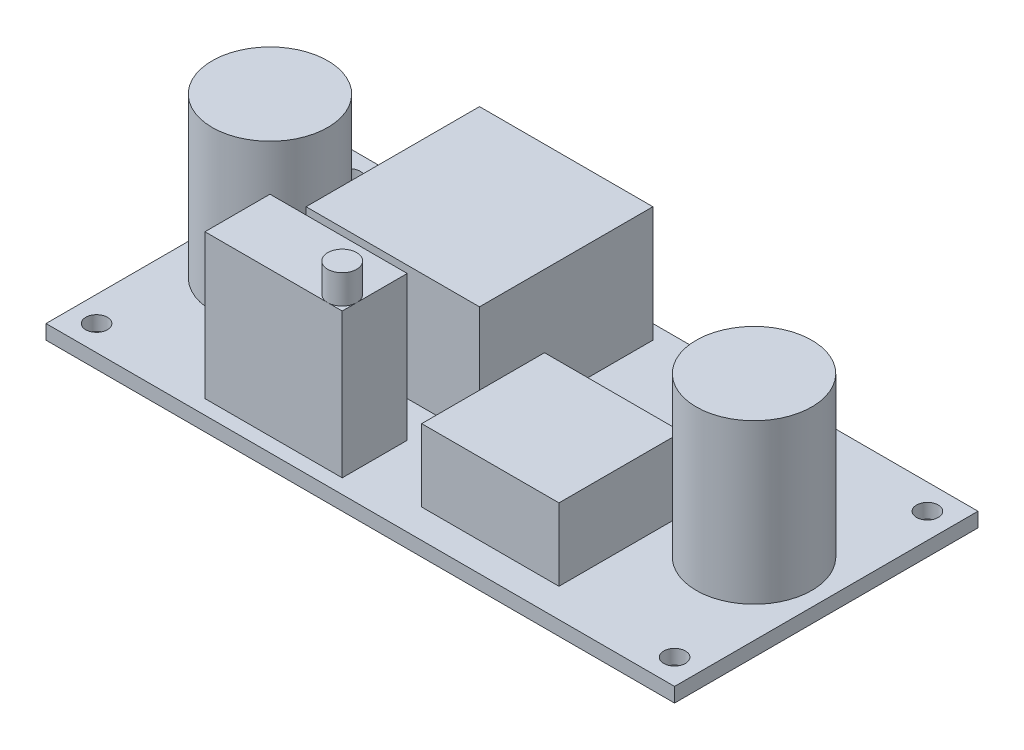
ISO-10303-21;
HEADER;
FILE_DESCRIPTION(('STEP AP214'),'2;1');
FILE_NAME('part.step','',(''),(''),'','','');
FILE_SCHEMA(('AUTOMOTIVE_DESIGN { 1 0 10303 214 1 1 1 1 }'));
ENDSEC;
DATA;
#1=APPLICATION_CONTEXT('core data for automotive mechanical design processes');
#2=APPLICATION_PROTOCOL_DEFINITION('international standard','automotive_design',2000,#1);
#3=PRODUCT_CONTEXT('',#1,'mechanical');
#4=PRODUCT('Part','Part','',(#3));
#5=PRODUCT_RELATED_PRODUCT_CATEGORY('part','',(#4));
#6=PRODUCT_DEFINITION_FORMATION('','',#4);
#7=PRODUCT_DEFINITION_CONTEXT('part definition',#1,'design');
#8=PRODUCT_DEFINITION('design','',#6,#7);
#9=PRODUCT_DEFINITION_SHAPE('','',#8);
#10=(LENGTH_UNIT() NAMED_UNIT(*) SI_UNIT(.MILLI.,.METRE.));
#11=(NAMED_UNIT(*) PLANE_ANGLE_UNIT() SI_UNIT($,.RADIAN.));
#12=(NAMED_UNIT(*) SI_UNIT($,.STERADIAN.) SOLID_ANGLE_UNIT());
#13=UNCERTAINTY_MEASURE_WITH_UNIT(LENGTH_MEASURE(1.E-05),#10,'distance_accuracy_value','');
#14=(GEOMETRIC_REPRESENTATION_CONTEXT(3) GLOBAL_UNCERTAINTY_ASSIGNED_CONTEXT((#13)) GLOBAL_UNIT_ASSIGNED_CONTEXT((#10,
#11,#12)) REPRESENTATION_CONTEXT('',''));
#15=CARTESIAN_POINT('',(0.,0.,0.));
#16=DIRECTION('',(0.,0.,1.));
#17=DIRECTION('',(1.,0.,0.));
#18=AXIS2_PLACEMENT_3D('',#15,#16,#17);
#19=CARTESIAN_POINT('',(0.,10.,0.));
#20=DIRECTION('',(0.,1.,0.));
#21=DIRECTION('',(0.,0.,1.));
#22=AXIS2_PLACEMENT_3D('',#19,#20,#21);
#23=PLANE('',#22);
#24=CARTESIAN_POINT('',(-3.25,10.,8.5));
#25=DIRECTION('',(0.,1.,0.));
#26=DIRECTION('',(0.,0.,1.));
#27=AXIS2_PLACEMENT_3D('',#24,#25,#26);
#28=CIRCLE('',#27,1.);
#29=CARTESIAN_POINT('',(-3.25,10.,9.5));
#30=VERTEX_POINT('',#29);
#31=CARTESIAN_POINT('',(-2.25,10.,8.5));
#32=VERTEX_POINT('',#31);
#33=EDGE_CURVE('E46',#30,#32,#28,.T.);
#34=ORIENTED_EDGE('',*,*,#33,.F.);
#35=DIRECTION('',(1.,0.,0.));
#36=VECTOR('',#35,1.);
#37=CARTESIAN_POINT('',(0.,10.,9.5));
#38=LINE('',#37,#36);
#39=CARTESIAN_POINT('',(-2.25,10.,9.5));
#40=VERTEX_POINT('',#39);
#41=EDGE_CURVE('E163',#30,#40,#38,.T.);
#42=ORIENTED_EDGE('',*,*,#41,.T.);
#43=DIRECTION('',(0.,0.,1.));
#44=VECTOR('',#43,1.);
#45=CARTESIAN_POINT('',(-2.25,10.,0.));
#46=LINE('',#45,#44);
#47=EDGE_CURVE('E172',#32,#40,#46,.T.);
#48=ORIENTED_EDGE('',*,*,#47,.F.);
#49=EDGE_LOOP('',(#34,#42,#48));
#50=FACE_BOUND('',#49,.T.);
#51=ADVANCED_FACE('F35',(#50),#23,.T.);
#52=CARTESIAN_POINT('',(0.,0.,0.));
#53=DIRECTION('',(0.,1.,0.));
#54=DIRECTION('',(0.,0.,1.));
#55=AXIS2_PLACEMENT_3D('',#52,#53,#54);
#56=PLANE('',#55);
#57=DIRECTION('',(0.,0.,1.));
#58=VECTOR('',#57,1.);
#59=CARTESIAN_POINT('',(-2.25,0.,0.));
#60=LINE('',#59,#58);
#61=CARTESIAN_POINT('',(-2.25,0.,5.));
#62=VERTEX_POINT('',#61);
#63=CARTESIAN_POINT('',(-2.25,0.,9.5));
#64=VERTEX_POINT('',#63);
#65=EDGE_CURVE('E413',#62,#64,#60,.T.);
#66=ORIENTED_EDGE('',*,*,#65,.T.);
#67=DIRECTION('',(1.,0.,0.));
#68=VECTOR('',#67,1.);
#69=CARTESIAN_POINT('',(0.,0.,9.5));
#70=LINE('',#69,#68);
#71=CARTESIAN_POINT('',(-11.75,0.,9.5));
#72=VERTEX_POINT('',#71);
#73=EDGE_CURVE('E405',#72,#64,#70,.T.);
#74=ORIENTED_EDGE('',*,*,#73,.F.);
#75=DIRECTION('',(0.,0.,1.));
#76=VECTOR('',#75,1.);
#77=CARTESIAN_POINT('',(-11.75,0.,0.));
#78=LINE('',#77,#76);
#79=CARTESIAN_POINT('',(-11.75,0.,5.));
#80=VERTEX_POINT('',#79);
#81=EDGE_CURVE('E407',#80,#72,#78,.T.);
#82=ORIENTED_EDGE('',*,*,#81,.F.);
#83=DIRECTION('',(1.,0.,0.));
#84=VECTOR('',#83,1.);
#85=CARTESIAN_POINT('',(0.,0.,5.));
#86=LINE('',#85,#84);
#87=EDGE_CURVE('E410',#80,#62,#86,.T.);
#88=ORIENTED_EDGE('',*,*,#87,.T.);
#89=EDGE_LOOP('',(#66,#74,#82,#88));
#90=FACE_BOUND('',#89,.T.);
#91=DIRECTION('',(0.,0.,1.));
#92=VECTOR('',#91,1.);
#93=CARTESIAN_POINT('',(11.75,0.,0.));
#94=LINE('',#93,#92);
#95=CARTESIAN_POINT('',(11.75,0.,0.));
#96=VERTEX_POINT('',#95);
#97=CARTESIAN_POINT('',(11.75,0.,8.5));
#98=VERTEX_POINT('',#97);
#99=EDGE_CURVE('E387',#96,#98,#94,.T.);
#100=ORIENTED_EDGE('',*,*,#99,.T.);
#101=DIRECTION('',(1.,0.,0.));
#102=VECTOR('',#101,1.);
#103=CARTESIAN_POINT('',(0.,0.,8.5));
#104=LINE('',#103,#102);
#105=CARTESIAN_POINT('',(2.25,0.,8.5));
#106=VERTEX_POINT('',#105);
#107=EDGE_CURVE('E377',#106,#98,#104,.T.);
#108=ORIENTED_EDGE('',*,*,#107,.F.);
#109=DIRECTION('',(0.,0.,1.));
#110=VECTOR('',#109,1.);
#111=CARTESIAN_POINT('',(2.25,0.,0.));
#112=LINE('',#111,#110);
#113=CARTESIAN_POINT('',(2.25,0.,0.));
#114=VERTEX_POINT('',#113);
#115=EDGE_CURVE('E381',#114,#106,#112,.T.);
#116=ORIENTED_EDGE('',*,*,#115,.F.);
#117=DIRECTION('',(1.,0.,0.));
#118=VECTOR('',#117,1.);
#119=CARTESIAN_POINT('',(0.,0.,0.));
#120=LINE('',#119,#118);
#121=EDGE_CURVE('E384',#114,#96,#120,.T.);
#122=ORIENTED_EDGE('',*,*,#121,.T.);
#123=EDGE_LOOP('',(#100,#108,#116,#122));
#124=FACE_BOUND('',#123,.T.);
#125=CARTESIAN_POINT('',(16.75,0.,0.));
#126=DIRECTION('',(0.,1.,0.));
#127=DIRECTION('',(0.,0.,1.));
#128=AXIS2_PLACEMENT_3D('',#125,#126,#127);
#129=CIRCLE('',#128,4.);
#130=CARTESIAN_POINT('',(16.75,0.,3.99999999999999));
#131=VERTEX_POINT('',#130);
#132=EDGE_CURVE('E363',#131,#131,#129,.T.);
#133=ORIENTED_EDGE('',*,*,#132,.F.);
#134=EDGE_LOOP('',(#133));
#135=FACE_BOUND('',#134,.T.);
#136=CARTESIAN_POINT('',(-16.75,0.,0.));
#137=DIRECTION('',(0.,1.,0.));
#138=DIRECTION('',(0.,0.,1.));
#139=AXIS2_PLACEMENT_3D('',#136,#137,#138);
#140=CIRCLE('',#139,4.);
#141=CARTESIAN_POINT('',(-16.75,0.,4.));
#142=VERTEX_POINT('',#141);
#143=EDGE_CURVE('E357',#142,#142,#140,.T.);
#144=ORIENTED_EDGE('',*,*,#143,.F.);
#145=EDGE_LOOP('',(#144));
#146=FACE_BOUND('',#145,.T.);
#147=CARTESIAN_POINT('',(-20.,0.,8.75));
#148=DIRECTION('',(0.,1.,0.));
#149=DIRECTION('',(0.,0.,1.));
#150=AXIS2_PLACEMENT_3D('',#147,#148,#149);
#151=CIRCLE('',#150,0.750000000000002);
#152=CARTESIAN_POINT('',(-20.,0.,9.5));
#153=VERTEX_POINT('',#152);
#154=EDGE_CURVE('E304',#153,#153,#151,.T.);
#155=ORIENTED_EDGE('',*,*,#154,.F.);
#156=EDGE_LOOP('',(#155));
#157=FACE_BOUND('',#156,.T.);
#158=CARTESIAN_POINT('',(20.,0.,8.74999999999999));
#159=DIRECTION('',(0.,1.,0.));
#160=DIRECTION('',(0.,0.,1.));
#161=AXIS2_PLACEMENT_3D('',#158,#159,#160);
#162=CIRCLE('',#161,0.750000000000002);
#163=CARTESIAN_POINT('',(20.,0.,9.5));
#164=VERTEX_POINT('',#163);
#165=EDGE_CURVE('E301',#164,#164,#162,.T.);
#166=ORIENTED_EDGE('',*,*,#165,.F.);
#167=EDGE_LOOP('',(#166));
#168=FACE_BOUND('',#167,.T.);
#169=CARTESIAN_POINT('',(20.,0.,-8.74999999999999));
#170=DIRECTION('',(0.,1.,0.));
#171=DIRECTION('',(0.,0.,1.));
#172=AXIS2_PLACEMENT_3D('',#169,#170,#171);
#173=CIRCLE('',#172,0.750000000000002);
#174=CARTESIAN_POINT('',(20.,0.,-7.99999999999999));
#175=VERTEX_POINT('',#174);
#176=EDGE_CURVE('E303',#175,#175,#173,.T.);
#177=ORIENTED_EDGE('',*,*,#176,.F.);
#178=EDGE_LOOP('',(#177));
#179=FACE_BOUND('',#178,.T.);
#180=CARTESIAN_POINT('',(-20.,0.,-8.75));
#181=DIRECTION('',(0.,1.,0.));
#182=DIRECTION('',(0.,0.,1.));
#183=AXIS2_PLACEMENT_3D('',#180,#181,#182);
#184=CIRCLE('',#183,0.750000000000002);
#185=CARTESIAN_POINT('',(-20.,0.,-8.));
#186=VERTEX_POINT('',#185);
#187=EDGE_CURVE('E307',#186,#186,#184,.T.);
#188=ORIENTED_EDGE('',*,*,#187,.F.);
#189=EDGE_LOOP('',(#188));
#190=FACE_BOUND('',#189,.T.);
#191=DIRECTION('',(0.,0.,1.));
#192=VECTOR('',#191,1.);
#193=CARTESIAN_POINT('',(21.75,0.,0.));
#194=LINE('',#193,#192);
#195=CARTESIAN_POINT('',(21.75,0.,-10.5));
#196=VERTEX_POINT('',#195);
#197=CARTESIAN_POINT('',(21.75,0.,10.5));
#198=VERTEX_POINT('',#197);
#199=EDGE_CURVE('E316',#196,#198,#194,.T.);
#200=ORIENTED_EDGE('',*,*,#199,.F.);
#201=DIRECTION('',(1.,0.,0.));
#202=VECTOR('',#201,1.);
#203=CARTESIAN_POINT('',(0.,0.,-10.5));
#204=LINE('',#203,#202);
#205=CARTESIAN_POINT('',(-21.75,0.,-10.5));
#206=VERTEX_POINT('',#205);
#207=EDGE_CURVE('E319',#206,#196,#204,.T.);
#208=ORIENTED_EDGE('',*,*,#207,.F.);
#209=DIRECTION('',(0.,0.,1.));
#210=VECTOR('',#209,1.);
#211=CARTESIAN_POINT('',(-21.75,0.,0.));
#212=LINE('',#211,#210);
#213=CARTESIAN_POINT('',(-21.75,0.,10.5));
#214=VERTEX_POINT('',#213);
#215=EDGE_CURVE('E321',#206,#214,#212,.T.);
#216=ORIENTED_EDGE('',*,*,#215,.T.);
#217=DIRECTION('',(1.,0.,0.));
#218=VECTOR('',#217,1.);
#219=CARTESIAN_POINT('',(0.,0.,10.5));
#220=LINE('',#219,#218);
#221=EDGE_CURVE('E324',#214,#198,#220,.T.);
#222=ORIENTED_EDGE('',*,*,#221,.T.);
#223=EDGE_LOOP('',(#200,#208,#216,#222));
#224=FACE_BOUND('',#223,.T.);
#225=DIRECTION('',(0.,0.,1.));
#226=VECTOR('',#225,1.);
#227=CARTESIAN_POINT('',(-11.75,0.,0.));
#228=LINE('',#227,#226);
#229=CARTESIAN_POINT('',(-11.75,0.,-9.5));
#230=VERTEX_POINT('',#229);
#231=CARTESIAN_POINT('',(-11.75,0.,2.5));
#232=VERTEX_POINT('',#231);
#233=EDGE_CURVE('E59',#230,#232,#228,.T.);
#234=ORIENTED_EDGE('',*,*,#233,.F.);
#235=DIRECTION('',(-1.,0.,0.));
#236=VECTOR('',#235,1.);
#237=CARTESIAN_POINT('',(0.,0.,-9.5));
#238=LINE('',#237,#236);
#239=CARTESIAN_POINT('',(0.25,0.,-9.5));
#240=VERTEX_POINT('',#239);
#241=EDGE_CURVE('E440',#240,#230,#238,.T.);
#242=ORIENTED_EDGE('',*,*,#241,.F.);
#243=DIRECTION('',(0.,0.,1.));
#244=VECTOR('',#243,1.);
#245=CARTESIAN_POINT('',(0.250000000000001,0.,0.));
#246=LINE('',#245,#244);
#247=CARTESIAN_POINT('',(0.250000000000002,0.,2.5));
#248=VERTEX_POINT('',#247);
#249=EDGE_CURVE('E434',#240,#248,#246,.T.);
#250=ORIENTED_EDGE('',*,*,#249,.T.);
#251=DIRECTION('',(-1.,0.,0.));
#252=VECTOR('',#251,1.);
#253=CARTESIAN_POINT('',(0.,0.,2.5));
#254=LINE('',#253,#252);
#255=EDGE_CURVE('E437',#248,#232,#254,.T.);
#256=ORIENTED_EDGE('',*,*,#255,.T.);
#257=EDGE_LOOP('',(#234,#242,#250,#256));
#258=FACE_BOUND('',#257,.T.);
#259=ADVANCED_FACE('F193',(#90,#124,#135,#146,#157,#168,#179,#190,#224,#258),#56,.T.);
#260=CARTESIAN_POINT('',(21.75,-1.,0.));
#261=DIRECTION('',(-1.,0.,0.));
#262=DIRECTION('',(0.,0.,1.));
#263=AXIS2_PLACEMENT_3D('',#260,#261,#262);
#264=PLANE('',#263);
#265=ORIENTED_EDGE('',*,*,#199,.T.);
#266=DIRECTION('',(0.,1.,0.));
#267=VECTOR('',#266,1.);
#268=CARTESIAN_POINT('',(21.75,-1.,10.5));
#269=LINE('',#268,#267);
#270=CARTESIAN_POINT('',(21.75,-1.,10.5));
#271=VERTEX_POINT('',#270);
#272=EDGE_CURVE('E44',#271,#198,#269,.T.);
#273=ORIENTED_EDGE('',*,*,#272,.F.);
#274=DIRECTION('',(0.,0.,1.));
#275=VECTOR('',#274,1.);
#276=CARTESIAN_POINT('',(21.75,-1.,0.));
#277=LINE('',#276,#275);
#278=CARTESIAN_POINT('',(21.75,-1.,-10.5));
#279=VERTEX_POINT('',#278);
#280=EDGE_CURVE('E346',#279,#271,#277,.T.);
#281=ORIENTED_EDGE('',*,*,#280,.F.);
#282=DIRECTION('',(0.,1.,0.));
#283=VECTOR('',#282,1.);
#284=CARTESIAN_POINT('',(21.75,-1.,-10.5));
#285=LINE('',#284,#283);
#286=EDGE_CURVE('E39',#279,#196,#285,.T.);
#287=ORIENTED_EDGE('',*,*,#286,.T.);
#288=EDGE_LOOP('',(#265,#273,#281,#287));
#289=FACE_BOUND('',#288,.T.);
#290=ADVANCED_FACE('F198',(#289),#264,.F.);
#291=CARTESIAN_POINT('',(0.,-1.,10.5));
#292=DIRECTION('',(0.,0.,1.));
#293=DIRECTION('',(1.,0.,0.));
#294=AXIS2_PLACEMENT_3D('',#291,#292,#293);
#295=PLANE('',#294);
#296=ORIENTED_EDGE('',*,*,#221,.F.);
#297=DIRECTION('',(0.,1.,0.));
#298=VECTOR('',#297,1.);
#299=CARTESIAN_POINT('',(-21.75,-1.,10.5));
#300=LINE('',#299,#298);
#301=CARTESIAN_POINT('',(-21.75,-1.,10.5));
#302=VERTEX_POINT('',#301);
#303=EDGE_CURVE('E329',#302,#214,#300,.T.);
#304=ORIENTED_EDGE('',*,*,#303,.F.);
#305=DIRECTION('',(1.,0.,0.));
#306=VECTOR('',#305,1.);
#307=CARTESIAN_POINT('',(0.,-1.,10.5));
#308=LINE('',#307,#306);
#309=EDGE_CURVE('E334',#302,#271,#308,.T.);
#310=ORIENTED_EDGE('',*,*,#309,.T.);
#311=ORIENTED_EDGE('',*,*,#272,.T.);
#312=EDGE_LOOP('',(#296,#304,#310,#311));
#313=FACE_BOUND('',#312,.T.);
#314=ADVANCED_FACE('F267',(#313),#295,.T.);
#315=CARTESIAN_POINT('',(-21.75,-1.,0.));
#316=DIRECTION('',(-1.,0.,0.));
#317=DIRECTION('',(0.,0.,1.));
#318=AXIS2_PLACEMENT_3D('',#315,#316,#317);
#319=PLANE('',#318);
#320=ORIENTED_EDGE('',*,*,#215,.F.);
#321=DIRECTION('',(0.,1.,0.));
#322=VECTOR('',#321,1.);
#323=CARTESIAN_POINT('',(-21.75,-1.,-10.5));
#324=LINE('',#323,#322);
#325=CARTESIAN_POINT('',(-21.75,-1.,-10.5));
#326=VERTEX_POINT('',#325);
#327=EDGE_CURVE('E330',#326,#206,#324,.T.);
#328=ORIENTED_EDGE('',*,*,#327,.F.);
#329=DIRECTION('',(0.,0.,1.));
#330=VECTOR('',#329,1.);
#331=CARTESIAN_POINT('',(-21.75,-1.,0.));
#332=LINE('',#331,#330);
#333=EDGE_CURVE('E339',#326,#302,#332,.T.);
#334=ORIENTED_EDGE('',*,*,#333,.T.);
#335=ORIENTED_EDGE('',*,*,#303,.T.);
#336=EDGE_LOOP('',(#320,#328,#334,#335));
#337=FACE_BOUND('',#336,.T.);
#338=ADVANCED_FACE('F270',(#337),#319,.T.);
#339=CARTESIAN_POINT('',(-20.,-1.,-8.75));
#340=DIRECTION('',(0.,1.,0.));
#341=DIRECTION('',(0.,0.,1.));
#342=AXIS2_PLACEMENT_3D('',#339,#340,#341);
#343=CYLINDRICAL_SURFACE('',#342,0.750000000000002);
#344=CARTESIAN_POINT('',(-20.,-1.,-8.75));
#345=DIRECTION('',(0.,1.,0.));
#346=DIRECTION('',(0.,0.,1.));
#347=AXIS2_PLACEMENT_3D('',#344,#345,#346);
#348=CIRCLE('',#347,0.750000000000002);
#349=CARTESIAN_POINT('',(-20.,-1.,-8.));
#350=VERTEX_POINT('',#349);
#351=EDGE_CURVE('E348',#350,#350,#348,.T.);
#352=ORIENTED_EDGE('',*,*,#351,.F.);
#353=EDGE_LOOP('',(#352));
#354=FACE_BOUND('',#353,.T.);
#355=ORIENTED_EDGE('',*,*,#187,.T.);
#356=EDGE_LOOP('',(#355));
#357=FACE_BOUND('',#356,.T.);
#358=ADVANCED_FACE('F274',(#354,#357),#343,.F.);
#359=CARTESIAN_POINT('',(20.,-1.,-8.74999999999999));
#360=DIRECTION('',(0.,1.,0.));
#361=DIRECTION('',(0.,0.,1.));
#362=AXIS2_PLACEMENT_3D('',#359,#360,#361);
#363=CYLINDRICAL_SURFACE('',#362,0.750000000000002);
#364=CARTESIAN_POINT('',(20.,-1.,-8.74999999999999));
#365=DIRECTION('',(0.,1.,0.));
#366=DIRECTION('',(0.,0.,1.));
#367=AXIS2_PLACEMENT_3D('',#364,#365,#366);
#368=CIRCLE('',#367,0.750000000000002);
#369=CARTESIAN_POINT('',(20.,-1.,-7.99999999999999));
#370=VERTEX_POINT('',#369);
#371=EDGE_CURVE('E351',#370,#370,#368,.T.);
#372=ORIENTED_EDGE('',*,*,#371,.F.);
#373=EDGE_LOOP('',(#372));
#374=FACE_BOUND('',#373,.T.);
#375=ORIENTED_EDGE('',*,*,#176,.T.);
#376=EDGE_LOOP('',(#375));
#377=FACE_BOUND('',#376,.T.);
#378=ADVANCED_FACE('F284',(#374,#377),#363,.F.);
#379=CARTESIAN_POINT('',(20.,-1.,8.74999999999999));
#380=DIRECTION('',(0.,1.,0.));
#381=DIRECTION('',(0.,0.,1.));
#382=AXIS2_PLACEMENT_3D('',#379,#380,#381);
#383=CYLINDRICAL_SURFACE('',#382,0.750000000000002);
#384=CARTESIAN_POINT('',(20.,-1.,8.74999999999999));
#385=DIRECTION('',(0.,1.,0.));
#386=DIRECTION('',(0.,0.,1.));
#387=AXIS2_PLACEMENT_3D('',#384,#385,#386);
#388=CIRCLE('',#387,0.750000000000002);
#389=CARTESIAN_POINT('',(20.,-1.,9.5));
#390=VERTEX_POINT('',#389);
#391=EDGE_CURVE('E298',#390,#390,#388,.T.);
#392=ORIENTED_EDGE('',*,*,#391,.F.);
#393=EDGE_LOOP('',(#392));
#394=FACE_BOUND('',#393,.T.);
#395=ORIENTED_EDGE('',*,*,#165,.T.);
#396=EDGE_LOOP('',(#395));
#397=FACE_BOUND('',#396,.T.);
#398=ADVANCED_FACE('F287',(#394,#397),#383,.F.);
#399=CARTESIAN_POINT('',(-20.,-1.,8.75));
#400=DIRECTION('',(0.,1.,0.));
#401=DIRECTION('',(0.,0.,1.));
#402=AXIS2_PLACEMENT_3D('',#399,#400,#401);
#403=CYLINDRICAL_SURFACE('',#402,0.750000000000002);
#404=CARTESIAN_POINT('',(-20.,-1.,8.75));
#405=DIRECTION('',(0.,1.,0.));
#406=DIRECTION('',(0.,0.,1.));
#407=AXIS2_PLACEMENT_3D('',#404,#405,#406);
#408=CIRCLE('',#407,0.750000000000002);
#409=CARTESIAN_POINT('',(-20.,-1.,9.5));
#410=VERTEX_POINT('',#409);
#411=EDGE_CURVE('E327',#410,#410,#408,.T.);
#412=ORIENTED_EDGE('',*,*,#411,.F.);
#413=EDGE_LOOP('',(#412));
#414=FACE_BOUND('',#413,.T.);
#415=ORIENTED_EDGE('',*,*,#154,.T.);
#416=EDGE_LOOP('',(#415));
#417=FACE_BOUND('',#416,.T.);
#418=ADVANCED_FACE('F37',(#414,#417),#403,.F.);
#419=CARTESIAN_POINT('',(0.,-1.,-10.5));
#420=DIRECTION('',(0.,0.,1.));
#421=DIRECTION('',(1.,0.,0.));
#422=AXIS2_PLACEMENT_3D('',#419,#420,#421);
#423=PLANE('',#422);
#424=ORIENTED_EDGE('',*,*,#207,.T.);
#425=ORIENTED_EDGE('',*,*,#286,.F.);
#426=DIRECTION('',(1.,0.,0.));
#427=VECTOR('',#426,1.);
#428=CARTESIAN_POINT('',(0.,-1.,-10.5));
#429=LINE('',#428,#427);
#430=EDGE_CURVE('E342',#326,#279,#429,.T.);
#431=ORIENTED_EDGE('',*,*,#430,.F.);
#432=ORIENTED_EDGE('',*,*,#327,.T.);
#433=EDGE_LOOP('',(#424,#425,#431,#432));
#434=FACE_BOUND('',#433,.T.);
#435=ADVANCED_FACE('F264',(#434),#423,.F.);
#436=CARTESIAN_POINT('',(0.,-1.,0.));
#437=DIRECTION('',(0.,1.,0.));
#438=DIRECTION('',(0.,0.,1.));
#439=AXIS2_PLACEMENT_3D('',#436,#437,#438);
#440=PLANE('',#439);
#441=ORIENTED_EDGE('',*,*,#411,.T.);
#442=EDGE_LOOP('',(#441));
#443=FACE_BOUND('',#442,.T.);
#444=ORIENTED_EDGE('',*,*,#391,.T.);
#445=EDGE_LOOP('',(#444));
#446=FACE_BOUND('',#445,.T.);
#447=ORIENTED_EDGE('',*,*,#371,.T.);
#448=EDGE_LOOP('',(#447));
#449=FACE_BOUND('',#448,.T.);
#450=ORIENTED_EDGE('',*,*,#351,.T.);
#451=EDGE_LOOP('',(#450));
#452=FACE_BOUND('',#451,.T.);
#453=ORIENTED_EDGE('',*,*,#280,.T.);
#454=ORIENTED_EDGE('',*,*,#309,.F.);
#455=ORIENTED_EDGE('',*,*,#333,.F.);
#456=ORIENTED_EDGE('',*,*,#430,.T.);
#457=EDGE_LOOP('',(#453,#454,#455,#456));
#458=FACE_BOUND('',#457,.T.);
#459=ADVANCED_FACE('F261',(#443,#446,#449,#452,#458),#440,.F.);
#460=CARTESIAN_POINT('',(-16.75,11.,0.));
#461=DIRECTION('',(0.,-1.,0.));
#462=DIRECTION('',(0.,0.,-1.));
#463=AXIS2_PLACEMENT_3D('',#460,#461,#462);
#464=CYLINDRICAL_SURFACE('',#463,4.);
#465=CARTESIAN_POINT('',(-16.75,11.,0.));
#466=DIRECTION('',(0.,1.,0.));
#467=DIRECTION('',(0.,0.,1.));
#468=AXIS2_PLACEMENT_3D('',#465,#466,#467);
#469=CIRCLE('',#468,4.);
#470=CARTESIAN_POINT('',(-16.75,11.,4.));
#471=VERTEX_POINT('',#470);
#472=EDGE_CURVE('E310',#471,#471,#469,.T.);
#473=ORIENTED_EDGE('',*,*,#472,.F.);
#474=EDGE_LOOP('',(#473));
#475=FACE_BOUND('',#474,.T.);
#476=ORIENTED_EDGE('',*,*,#143,.T.);
#477=EDGE_LOOP('',(#476));
#478=FACE_BOUND('',#477,.T.);
#479=ADVANCED_FACE('F257',(#475,#478),#464,.T.);
#480=CARTESIAN_POINT('',(0.,11.,0.));
#481=DIRECTION('',(0.,1.,0.));
#482=DIRECTION('',(0.,0.,1.));
#483=AXIS2_PLACEMENT_3D('',#480,#481,#482);
#484=PLANE('',#483);
#485=ORIENTED_EDGE('',*,*,#472,.T.);
#486=EDGE_LOOP('',(#485));
#487=FACE_BOUND('',#486,.T.);
#488=ADVANCED_FACE('F253',(#487),#484,.T.);
#489=CARTESIAN_POINT('',(16.75,11.,0.));
#490=DIRECTION('',(0.,-1.,0.));
#491=DIRECTION('',(0.,0.,-1.));
#492=AXIS2_PLACEMENT_3D('',#489,#490,#491);
#493=CYLINDRICAL_SURFACE('',#492,4.);
#494=CARTESIAN_POINT('',(16.75,11.,0.));
#495=DIRECTION('',(0.,1.,0.));
#496=DIRECTION('',(0.,0.,1.));
#497=AXIS2_PLACEMENT_3D('',#494,#495,#496);
#498=CIRCLE('',#497,4.);
#499=CARTESIAN_POINT('',(16.75,11.,3.99999999999999));
#500=VERTEX_POINT('',#499);
#501=EDGE_CURVE('E360',#500,#500,#498,.T.);
#502=ORIENTED_EDGE('',*,*,#501,.F.);
#503=EDGE_LOOP('',(#502));
#504=FACE_BOUND('',#503,.T.);
#505=ORIENTED_EDGE('',*,*,#132,.T.);
#506=EDGE_LOOP('',(#505));
#507=FACE_BOUND('',#506,.T.);
#508=ADVANCED_FACE('F249',(#504,#507),#493,.T.);
#509=CARTESIAN_POINT('',(0.,11.,0.));
#510=DIRECTION('',(0.,1.,0.));
#511=DIRECTION('',(0.,0.,1.));
#512=AXIS2_PLACEMENT_3D('',#509,#510,#511);
#513=PLANE('',#512);
#514=ORIENTED_EDGE('',*,*,#501,.T.);
#515=EDGE_LOOP('',(#514));
#516=FACE_BOUND('',#515,.T.);
#517=ADVANCED_FACE('F245',(#516),#513,.T.);
#518=CARTESIAN_POINT('',(11.75,5.,0.));
#519=DIRECTION('',(1.,0.,0.));
#520=DIRECTION('',(0.,0.,-1.));
#521=AXIS2_PLACEMENT_3D('',#518,#519,#520);
#522=PLANE('',#521);
#523=ORIENTED_EDGE('',*,*,#99,.F.);
#524=DIRECTION('',(0.,-1.,0.));
#525=VECTOR('',#524,1.);
#526=CARTESIAN_POINT('',(11.75,5.,0.));
#527=LINE('',#526,#525);
#528=CARTESIAN_POINT('',(11.75,5.,0.));
#529=VERTEX_POINT('',#528);
#530=EDGE_CURVE('E366',#529,#96,#527,.T.);
#531=ORIENTED_EDGE('',*,*,#530,.F.);
#532=DIRECTION('',(0.,0.,1.));
#533=VECTOR('',#532,1.);
#534=CARTESIAN_POINT('',(11.75,5.,0.));
#535=LINE('',#534,#533);
#536=CARTESIAN_POINT('',(11.75,5.,8.5));
#537=VERTEX_POINT('',#536);
#538=EDGE_CURVE('E380',#529,#537,#535,.T.);
#539=ORIENTED_EDGE('',*,*,#538,.T.);
#540=DIRECTION('',(0.,-1.,0.));
#541=VECTOR('',#540,1.);
#542=CARTESIAN_POINT('',(11.75,5.,8.5));
#543=LINE('',#542,#541);
#544=EDGE_CURVE('E374',#537,#98,#543,.T.);
#545=ORIENTED_EDGE('',*,*,#544,.T.);
#546=EDGE_LOOP('',(#523,#531,#539,#545));
#547=FACE_BOUND('',#546,.T.);
#548=ADVANCED_FACE('F241',(#547),#522,.T.);
#549=CARTESIAN_POINT('',(0.,5.,0.));
#550=DIRECTION('',(0.,0.,-1.));
#551=DIRECTION('',(-1.,0.,0.));
#552=AXIS2_PLACEMENT_3D('',#549,#550,#551);
#553=PLANE('',#552);
#554=ORIENTED_EDGE('',*,*,#121,.F.);
#555=DIRECTION('',(0.,-1.,0.));
#556=VECTOR('',#555,1.);
#557=CARTESIAN_POINT('',(2.25,5.,0.));
#558=LINE('',#557,#556);
#559=CARTESIAN_POINT('',(2.25,5.,0.));
#560=VERTEX_POINT('',#559);
#561=EDGE_CURVE('E370',#560,#114,#558,.T.);
#562=ORIENTED_EDGE('',*,*,#561,.F.);
#563=DIRECTION('',(1.,0.,0.));
#564=VECTOR('',#563,1.);
#565=CARTESIAN_POINT('',(0.,5.,0.));
#566=LINE('',#565,#564);
#567=EDGE_CURVE('E394',#560,#529,#566,.T.);
#568=ORIENTED_EDGE('',*,*,#567,.T.);
#569=ORIENTED_EDGE('',*,*,#530,.T.);
#570=EDGE_LOOP('',(#554,#562,#568,#569));
#571=FACE_BOUND('',#570,.T.);
#572=ADVANCED_FACE('F237',(#571),#553,.T.);
#573=CARTESIAN_POINT('',(2.25,5.,0.));
#574=DIRECTION('',(1.,0.,0.));
#575=DIRECTION('',(0.,0.,-1.));
#576=AXIS2_PLACEMENT_3D('',#573,#574,#575);
#577=PLANE('',#576);
#578=ORIENTED_EDGE('',*,*,#115,.T.);
#579=DIRECTION('',(0.,-1.,0.));
#580=VECTOR('',#579,1.);
#581=CARTESIAN_POINT('',(2.25,5.,8.5));
#582=LINE('',#581,#580);
#583=CARTESIAN_POINT('',(2.25,5.,8.5));
#584=VERTEX_POINT('',#583);
#585=EDGE_CURVE('E372',#584,#106,#582,.T.);
#586=ORIENTED_EDGE('',*,*,#585,.F.);
#587=DIRECTION('',(0.,0.,1.));
#588=VECTOR('',#587,1.);
#589=CARTESIAN_POINT('',(2.25,5.,0.));
#590=LINE('',#589,#588);
#591=EDGE_CURVE('E392',#560,#584,#590,.T.);
#592=ORIENTED_EDGE('',*,*,#591,.F.);
#593=ORIENTED_EDGE('',*,*,#561,.T.);
#594=EDGE_LOOP('',(#578,#586,#592,#593));
#595=FACE_BOUND('',#594,.T.);
#596=ADVANCED_FACE('F233',(#595),#577,.F.);
#597=CARTESIAN_POINT('',(0.,5.,8.5));
#598=DIRECTION('',(0.,0.,-1.));
#599=DIRECTION('',(-1.,0.,0.));
#600=AXIS2_PLACEMENT_3D('',#597,#598,#599);
#601=PLANE('',#600);
#602=ORIENTED_EDGE('',*,*,#107,.T.);
#603=ORIENTED_EDGE('',*,*,#544,.F.);
#604=DIRECTION('',(1.,0.,0.));
#605=VECTOR('',#604,1.);
#606=CARTESIAN_POINT('',(0.,5.,8.5));
#607=LINE('',#606,#605);
#608=EDGE_CURVE('E376',#584,#537,#607,.T.);
#609=ORIENTED_EDGE('',*,*,#608,.F.);
#610=ORIENTED_EDGE('',*,*,#585,.T.);
#611=EDGE_LOOP('',(#602,#603,#609,#610));
#612=FACE_BOUND('',#611,.T.);
#613=ADVANCED_FACE('F229',(#612),#601,.F.);
#614=CARTESIAN_POINT('',(0.,5.,0.));
#615=DIRECTION('',(0.,1.,0.));
#616=DIRECTION('',(0.,0.,1.));
#617=AXIS2_PLACEMENT_3D('',#614,#615,#616);
#618=PLANE('',#617);
#619=ORIENTED_EDGE('',*,*,#538,.F.);
#620=ORIENTED_EDGE('',*,*,#567,.F.);
#621=ORIENTED_EDGE('',*,*,#591,.T.);
#622=ORIENTED_EDGE('',*,*,#608,.T.);
#623=EDGE_LOOP('',(#619,#620,#621,#622));
#624=FACE_BOUND('',#623,.T.);
#625=ADVANCED_FACE('F225',(#624),#618,.T.);
#626=CARTESIAN_POINT('',(-2.25,10.,0.));
#627=DIRECTION('',(1.,0.,0.));
#628=DIRECTION('',(0.,0.,-1.));
#629=AXIS2_PLACEMENT_3D('',#626,#627,#628);
#630=PLANE('',#629);
#631=ORIENTED_EDGE('',*,*,#65,.F.);
#632=DIRECTION('',(0.,-1.,0.));
#633=VECTOR('',#632,1.);
#634=CARTESIAN_POINT('',(-2.25,10.,5.));
#635=LINE('',#634,#633);
#636=CARTESIAN_POINT('',(-2.25,10.,5.));
#637=VERTEX_POINT('',#636);
#638=EDGE_CURVE('E390',#637,#62,#635,.T.);
#639=ORIENTED_EDGE('',*,*,#638,.F.);
#640=EDGE_CURVE('E421',#637,#32,#46,.T.);
#641=ORIENTED_EDGE('',*,*,#640,.T.);
#642=ORIENTED_EDGE('',*,*,#47,.T.);
#643=DIRECTION('',(0.,-1.,0.));
#644=VECTOR('',#643,1.);
#645=CARTESIAN_POINT('',(-2.25,10.,9.5));
#646=LINE('',#645,#644);
#647=EDGE_CURVE('E162',#40,#64,#646,.T.);
#648=ORIENTED_EDGE('',*,*,#647,.T.);
#649=EDGE_LOOP('',(#631,#639,#641,#642,#648));
#650=FACE_BOUND('',#649,.T.);
#651=ADVANCED_FACE('F221',(#650),#630,.T.);
#652=CARTESIAN_POINT('',(0.,10.,5.));
#653=DIRECTION('',(0.,0.,-1.));
#654=DIRECTION('',(-1.,0.,0.));
#655=AXIS2_PLACEMENT_3D('',#652,#653,#654);
#656=PLANE('',#655);
#657=ORIENTED_EDGE('',*,*,#87,.F.);
#658=DIRECTION('',(0.,-1.,0.));
#659=VECTOR('',#658,1.);
#660=CARTESIAN_POINT('',(-11.75,10.,5.));
#661=LINE('',#660,#659);
#662=CARTESIAN_POINT('',(-11.75,10.,5.));
#663=VERTEX_POINT('',#662);
#664=EDGE_CURVE('E400',#663,#80,#661,.T.);
#665=ORIENTED_EDGE('',*,*,#664,.F.);
#666=DIRECTION('',(1.,0.,0.));
#667=VECTOR('',#666,1.);
#668=CARTESIAN_POINT('',(0.,10.,5.));
#669=LINE('',#668,#667);
#670=EDGE_CURVE('E418',#663,#637,#669,.T.);
#671=ORIENTED_EDGE('',*,*,#670,.T.);
#672=ORIENTED_EDGE('',*,*,#638,.T.);
#673=EDGE_LOOP('',(#657,#665,#671,#672));
#674=FACE_BOUND('',#673,.T.);
#675=ADVANCED_FACE('F215',(#674),#656,.T.);
#676=CARTESIAN_POINT('',(-11.75,10.,0.));
#677=DIRECTION('',(1.,0.,0.));
#678=DIRECTION('',(0.,0.,-1.));
#679=AXIS2_PLACEMENT_3D('',#676,#677,#678);
#680=PLANE('',#679);
#681=ORIENTED_EDGE('',*,*,#81,.T.);
#682=DIRECTION('',(0.,-1.,0.));
#683=VECTOR('',#682,1.);
#684=CARTESIAN_POINT('',(-11.75,10.,9.5));
#685=LINE('',#684,#683);
#686=CARTESIAN_POINT('',(-11.75,10.,9.5));
#687=VERTEX_POINT('',#686);
#688=EDGE_CURVE('E402',#687,#72,#685,.T.);
#689=ORIENTED_EDGE('',*,*,#688,.F.);
#690=DIRECTION('',(0.,0.,1.));
#691=VECTOR('',#690,1.);
#692=CARTESIAN_POINT('',(-11.75,10.,0.));
#693=LINE('',#692,#691);
#694=EDGE_CURVE('E159',#663,#687,#693,.T.);
#695=ORIENTED_EDGE('',*,*,#694,.F.);
#696=ORIENTED_EDGE('',*,*,#664,.T.);
#697=EDGE_LOOP('',(#681,#689,#695,#696));
#698=FACE_BOUND('',#697,.T.);
#699=ADVANCED_FACE('F211',(#698),#680,.F.);
#700=CARTESIAN_POINT('',(0.,10.,9.5));
#701=DIRECTION('',(0.,0.,-1.));
#702=DIRECTION('',(-1.,0.,0.));
#703=AXIS2_PLACEMENT_3D('',#700,#701,#702);
#704=PLANE('',#703);
#705=ORIENTED_EDGE('',*,*,#73,.T.);
#706=ORIENTED_EDGE('',*,*,#647,.F.);
#707=ORIENTED_EDGE('',*,*,#41,.F.);
#708=EDGE_CURVE('E154',#687,#30,#38,.T.);
#709=ORIENTED_EDGE('',*,*,#708,.F.);
#710=ORIENTED_EDGE('',*,*,#688,.T.);
#711=EDGE_LOOP('',(#705,#706,#707,#709,#710));
#712=FACE_BOUND('',#711,.T.);
#713=ADVANCED_FACE('F168',(#712),#704,.F.);
#714=EDGE_CURVE('E11',#32,#30,#28,.T.);
#715=ORIENTED_EDGE('',*,*,#714,.F.);
#716=ORIENTED_EDGE('',*,*,#640,.F.);
#717=ORIENTED_EDGE('',*,*,#670,.F.);
#718=ORIENTED_EDGE('',*,*,#694,.T.);
#719=ORIENTED_EDGE('',*,*,#708,.T.);
#720=EDGE_LOOP('',(#715,#716,#717,#718,#719));
#721=FACE_BOUND('',#720,.T.);
#722=ADVANCED_FACE('F156',(#721),#23,.T.);
#723=CARTESIAN_POINT('',(0.,8.,-9.5));
#724=DIRECTION('',(0.,0.,1.));
#725=DIRECTION('',(1.,0.,0.));
#726=AXIS2_PLACEMENT_3D('',#723,#724,#725);
#727=PLANE('',#726);
#728=ORIENTED_EDGE('',*,*,#241,.T.);
#729=DIRECTION('',(0.,-1.,0.));
#730=VECTOR('',#729,1.);
#731=CARTESIAN_POINT('',(-11.75,8.,-9.5));
#732=LINE('',#731,#730);
#733=CARTESIAN_POINT('',(-11.75,8.,-9.5));
#734=VERTEX_POINT('',#733);
#735=EDGE_CURVE('E415',#734,#230,#732,.T.);
#736=ORIENTED_EDGE('',*,*,#735,.F.);
#737=DIRECTION('',(-1.,0.,0.));
#738=VECTOR('',#737,1.);
#739=CARTESIAN_POINT('',(0.,8.,-9.5));
#740=LINE('',#739,#738);
#741=CARTESIAN_POINT('',(0.25,8.,-9.5));
#742=VERTEX_POINT('',#741);
#743=EDGE_CURVE('E436',#742,#734,#740,.T.);
#744=ORIENTED_EDGE('',*,*,#743,.F.);
#745=DIRECTION('',(0.,-1.,0.));
#746=VECTOR('',#745,1.);
#747=CARTESIAN_POINT('',(0.25,8.,-9.5));
#748=LINE('',#747,#746);
#749=EDGE_CURVE('E430',#742,#240,#748,.T.);
#750=ORIENTED_EDGE('',*,*,#749,.T.);
#751=EDGE_LOOP('',(#728,#736,#744,#750));
#752=FACE_BOUND('',#751,.T.);
#753=ADVANCED_FACE('F204',(#752),#727,.F.);
#754=CARTESIAN_POINT('',(-11.75,8.,0.));
#755=DIRECTION('',(1.,0.,0.));
#756=DIRECTION('',(0.,0.,-1.));
#757=AXIS2_PLACEMENT_3D('',#754,#755,#756);
#758=PLANE('',#757);
#759=ORIENTED_EDGE('',*,*,#233,.T.);
#760=DIRECTION('',(0.,-1.,0.));
#761=VECTOR('',#760,1.);
#762=CARTESIAN_POINT('',(-11.75,8.,2.5));
#763=LINE('',#762,#761);
#764=CARTESIAN_POINT('',(-11.75,8.,2.5));
#765=VERTEX_POINT('',#764);
#766=EDGE_CURVE('E424',#765,#232,#763,.T.);
#767=ORIENTED_EDGE('',*,*,#766,.F.);
#768=DIRECTION('',(0.,0.,1.));
#769=VECTOR('',#768,1.);
#770=CARTESIAN_POINT('',(-11.75,8.,0.));
#771=LINE('',#770,#769);
#772=EDGE_CURVE('E448',#734,#765,#771,.T.);
#773=ORIENTED_EDGE('',*,*,#772,.F.);
#774=ORIENTED_EDGE('',*,*,#735,.T.);
#775=EDGE_LOOP('',(#759,#767,#773,#774));
#776=FACE_BOUND('',#775,.T.);
#777=ADVANCED_FACE('F209',(#776),#758,.F.);
#778=CARTESIAN_POINT('',(0.,8.,2.5));
#779=DIRECTION('',(0.,0.,1.));
#780=DIRECTION('',(1.,0.,0.));
#781=AXIS2_PLACEMENT_3D('',#778,#779,#780);
#782=PLANE('',#781);
#783=ORIENTED_EDGE('',*,*,#255,.F.);
#784=DIRECTION('',(0.,-1.,0.));
#785=VECTOR('',#784,1.);
#786=CARTESIAN_POINT('',(0.250000000000002,8.,2.5));
#787=LINE('',#786,#785);
#788=CARTESIAN_POINT('',(0.250000000000002,8.,2.5));
#789=VERTEX_POINT('',#788);
#790=EDGE_CURVE('E427',#789,#248,#787,.T.);
#791=ORIENTED_EDGE('',*,*,#790,.F.);
#792=DIRECTION('',(-1.,0.,0.));
#793=VECTOR('',#792,1.);
#794=CARTESIAN_POINT('',(0.,8.,2.5));
#795=LINE('',#794,#793);
#796=EDGE_CURVE('E445',#789,#765,#795,.T.);
#797=ORIENTED_EDGE('',*,*,#796,.T.);
#798=ORIENTED_EDGE('',*,*,#766,.T.);
#799=EDGE_LOOP('',(#783,#791,#797,#798));
#800=FACE_BOUND('',#799,.T.);
#801=ADVANCED_FACE('F461',(#800),#782,.T.);
#802=CARTESIAN_POINT('',(0.250000000000001,8.,0.));
#803=DIRECTION('',(1.,0.,0.));
#804=DIRECTION('',(0.,0.,-1.));
#805=AXIS2_PLACEMENT_3D('',#802,#803,#804);
#806=PLANE('',#805);
#807=ORIENTED_EDGE('',*,*,#249,.F.);
#808=ORIENTED_EDGE('',*,*,#749,.F.);
#809=DIRECTION('',(0.,0.,1.));
#810=VECTOR('',#809,1.);
#811=CARTESIAN_POINT('',(0.250000000000001,8.,0.));
#812=LINE('',#811,#810);
#813=EDGE_CURVE('E433',#742,#789,#812,.T.);
#814=ORIENTED_EDGE('',*,*,#813,.T.);
#815=ORIENTED_EDGE('',*,*,#790,.T.);
#816=EDGE_LOOP('',(#807,#808,#814,#815));
#817=FACE_BOUND('',#816,.T.);
#818=ADVANCED_FACE('F188',(#817),#806,.T.);
#819=CARTESIAN_POINT('',(0.,8.,0.));
#820=DIRECTION('',(0.,1.,0.));
#821=DIRECTION('',(0.,0.,1.));
#822=AXIS2_PLACEMENT_3D('',#819,#820,#821);
#823=PLANE('',#822);
#824=ORIENTED_EDGE('',*,*,#743,.T.);
#825=ORIENTED_EDGE('',*,*,#772,.T.);
#826=ORIENTED_EDGE('',*,*,#796,.F.);
#827=ORIENTED_EDGE('',*,*,#813,.F.);
#828=EDGE_LOOP('',(#824,#825,#826,#827));
#829=FACE_BOUND('',#828,.T.);
#830=ADVANCED_FACE('F179',(#829),#823,.T.);
#831=CARTESIAN_POINT('',(-3.25,12.,8.5));
#832=DIRECTION('',(0.,-1.,0.));
#833=DIRECTION('',(0.,0.,-1.));
#834=AXIS2_PLACEMENT_3D('',#831,#832,#833);
#835=CYLINDRICAL_SURFACE('',#834,1.);
#836=CARTESIAN_POINT('',(-3.25,12.,8.5));
#837=DIRECTION('',(0.,1.,0.));
#838=DIRECTION('',(0.,0.,1.));
#839=AXIS2_PLACEMENT_3D('',#836,#837,#838);
#840=CIRCLE('',#839,1.);
#841=CARTESIAN_POINT('',(-3.25,12.,9.5));
#842=VERTEX_POINT('',#841);
#843=EDGE_CURVE('E175',#842,#842,#840,.T.);
#844=ORIENTED_EDGE('',*,*,#843,.F.);
#845=EDGE_LOOP('',(#844));
#846=FACE_BOUND('',#845,.T.);
#847=ORIENTED_EDGE('',*,*,#33,.T.);
#848=ORIENTED_EDGE('',*,*,#714,.T.);
#849=EDGE_LOOP('',(#847,#848));
#850=FACE_BOUND('',#849,.T.);
#851=ADVANCED_FACE('F176',(#846,#850),#835,.T.);
#852=CARTESIAN_POINT('',(-3.25,12.,8.5));
#853=DIRECTION('',(0.,1.,0.));
#854=DIRECTION('',(0.,0.,1.));
#855=AXIS2_PLACEMENT_3D('',#852,#853,#854);
#856=PLANE('',#855);
#857=ORIENTED_EDGE('',*,*,#843,.T.);
#858=EDGE_LOOP('',(#857));
#859=FACE_BOUND('',#858,.T.);
#860=ADVANCED_FACE('F178',(#859),#856,.T.);
#861=CLOSED_SHELL('',(#51,#259,#290,#314,#338,#358,#378,#398,#418,#435,#459,#479,#488,#508,#517,
#548,#572,#596,#613,#625,#651,#675,#699,#713,#722,#753,#777,#801,#818,#830,#851,#860));
#862=MANIFOLD_SOLID_BREP('B2',#861);
#863=ADVANCED_BREP_SHAPE_REPRESENTATION('',(#18,#862),#14);
#864=SHAPE_DEFINITION_REPRESENTATION(#9,#863);
ENDSEC;
END-ISO-10303-21;
